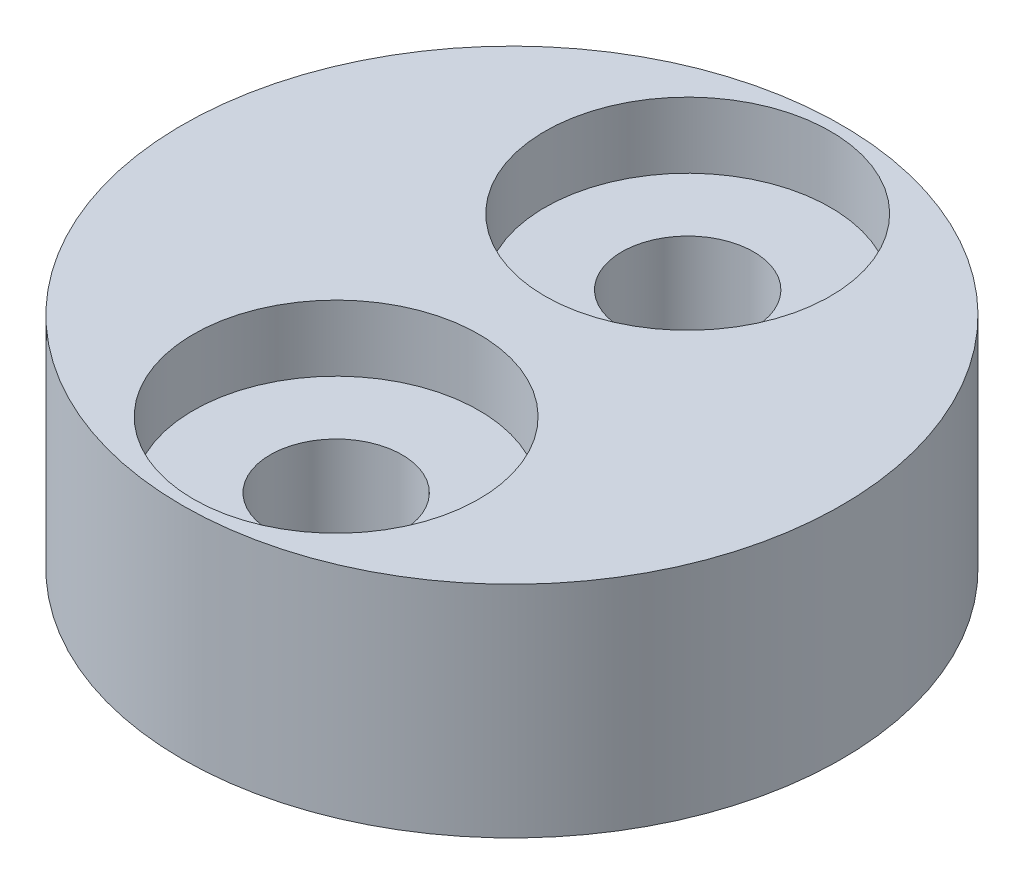
ISO-10303-21;
HEADER;
FILE_DESCRIPTION(('STEP AP214'),'2;1');
FILE_NAME('part.step','',(''),(''),'','','');
FILE_SCHEMA(('AUTOMOTIVE_DESIGN { 1 0 10303 214 1 1 1 1 }'));
ENDSEC;
DATA;
#1=APPLICATION_CONTEXT('core data for automotive mechanical design processes');
#2=APPLICATION_PROTOCOL_DEFINITION('international standard','automotive_design',2000,#1);
#3=PRODUCT_CONTEXT('',#1,'mechanical');
#4=PRODUCT('Part','Part','',(#3));
#5=PRODUCT_RELATED_PRODUCT_CATEGORY('part','',(#4));
#6=PRODUCT_DEFINITION_FORMATION('','',#4);
#7=PRODUCT_DEFINITION_CONTEXT('part definition',#1,'design');
#8=PRODUCT_DEFINITION('design','',#6,#7);
#9=PRODUCT_DEFINITION_SHAPE('','',#8);
#10=(LENGTH_UNIT() NAMED_UNIT(*) SI_UNIT(.MILLI.,.METRE.));
#11=(NAMED_UNIT(*) PLANE_ANGLE_UNIT() SI_UNIT($,.RADIAN.));
#12=(NAMED_UNIT(*) SI_UNIT($,.STERADIAN.) SOLID_ANGLE_UNIT());
#13=UNCERTAINTY_MEASURE_WITH_UNIT(LENGTH_MEASURE(1.E-05),#10,'distance_accuracy_value','');
#14=(GEOMETRIC_REPRESENTATION_CONTEXT(3) GLOBAL_UNCERTAINTY_ASSIGNED_CONTEXT((#13)) GLOBAL_UNIT_ASSIGNED_CONTEXT((#10,
#11,#12)) REPRESENTATION_CONTEXT('',''));
#15=CARTESIAN_POINT('',(0.,0.,0.));
#16=DIRECTION('',(0.,0.,1.));
#17=DIRECTION('',(1.,0.,0.));
#18=AXIS2_PLACEMENT_3D('',#15,#16,#17);
#19=CARTESIAN_POINT('',(0.,5.,-4.));
#20=DIRECTION('',(0.,-1.,0.));
#21=DIRECTION('',(0.,0.,-1.));
#22=AXIS2_PLACEMENT_3D('',#19,#20,#21);
#23=CYLINDRICAL_SURFACE('',#22,1.5);
#24=CARTESIAN_POINT('',(0.,0.,-4.));
#25=DIRECTION('',(0.,1.,0.));
#26=DIRECTION('',(0.,0.,1.));
#27=AXIS2_PLACEMENT_3D('',#24,#25,#26);
#28=CIRCLE('',#27,1.5);
#29=CARTESIAN_POINT('',(0.,0.,-2.5));
#30=VERTEX_POINT('',#29);
#31=EDGE_CURVE('E46',#30,#30,#28,.T.);
#32=ORIENTED_EDGE('',*,*,#31,.F.);
#33=EDGE_LOOP('',(#32));
#34=FACE_BOUND('',#33,.T.);
#35=CARTESIAN_POINT('',(0.,3.5,-4.));
#36=DIRECTION('',(0.,1.,0.));
#37=DIRECTION('',(0.,0.,1.));
#38=AXIS2_PLACEMENT_3D('',#35,#36,#37);
#39=CIRCLE('',#38,1.5);
#40=CARTESIAN_POINT('',(0.,3.5,-2.5));
#41=VERTEX_POINT('',#40);
#42=EDGE_CURVE('E37',#41,#41,#39,.T.);
#43=ORIENTED_EDGE('',*,*,#42,.T.);
#44=EDGE_LOOP('',(#43));
#45=FACE_BOUND('',#44,.T.);
#46=ADVANCED_FACE('F33',(#34,#45),#23,.F.);
#47=CARTESIAN_POINT('',(0.,5.,4.));
#48=DIRECTION('',(0.,-1.,0.));
#49=DIRECTION('',(0.,0.,-1.));
#50=AXIS2_PLACEMENT_3D('',#47,#48,#49);
#51=CYLINDRICAL_SURFACE('',#50,1.5);
#52=CARTESIAN_POINT('',(0.,0.,4.));
#53=DIRECTION('',(0.,1.,0.));
#54=DIRECTION('',(0.,0.,1.));
#55=AXIS2_PLACEMENT_3D('',#52,#53,#54);
#56=CIRCLE('',#55,1.5);
#57=CARTESIAN_POINT('',(0.,0.,5.5));
#58=VERTEX_POINT('',#57);
#59=EDGE_CURVE('E56',#58,#58,#56,.T.);
#60=ORIENTED_EDGE('',*,*,#59,.F.);
#61=EDGE_LOOP('',(#60));
#62=FACE_BOUND('',#61,.T.);
#63=CARTESIAN_POINT('',(0.,3.5,4.));
#64=DIRECTION('',(0.,1.,0.));
#65=DIRECTION('',(0.,0.,1.));
#66=AXIS2_PLACEMENT_3D('',#63,#64,#65);
#67=CIRCLE('',#66,1.5);
#68=CARTESIAN_POINT('',(0.,3.5,5.5));
#69=VERTEX_POINT('',#68);
#70=EDGE_CURVE('E50',#69,#69,#67,.T.);
#71=ORIENTED_EDGE('',*,*,#70,.T.);
#72=EDGE_LOOP('',(#71));
#73=FACE_BOUND('',#72,.T.);
#74=ADVANCED_FACE('F80',(#62,#73),#51,.F.);
#75=CARTESIAN_POINT('',(0.,5.,0.));
#76=DIRECTION('',(0.,1.,0.));
#77=DIRECTION('',(0.,0.,1.));
#78=AXIS2_PLACEMENT_3D('',#75,#76,#77);
#79=PLANE('',#78);
#80=CARTESIAN_POINT('',(0.,5.,-4.));
#81=DIRECTION('',(0.,1.,0.));
#82=DIRECTION('',(0.,0.,1.));
#83=AXIS2_PLACEMENT_3D('',#80,#81,#82);
#84=CIRCLE('',#83,3.25);
#85=CARTESIAN_POINT('',(0.,5.,-0.75));
#86=VERTEX_POINT('',#85);
#87=EDGE_CURVE('E58',#86,#86,#84,.T.);
#88=ORIENTED_EDGE('',*,*,#87,.F.);
#89=EDGE_LOOP('',(#88));
#90=FACE_BOUND('',#89,.T.);
#91=CARTESIAN_POINT('',(-4.03699863790571E-13,5.,4.));
#92=DIRECTION('',(0.,1.,0.));
#93=DIRECTION('',(0.,0.,1.));
#94=AXIS2_PLACEMENT_3D('',#91,#92,#93);
#95=CIRCLE('',#94,3.25);
#96=CARTESIAN_POINT('',(-4.03699863790571E-13,5.,7.25));
#97=VERTEX_POINT('',#96);
#98=EDGE_CURVE('E68',#97,#97,#95,.T.);
#99=ORIENTED_EDGE('',*,*,#98,.F.);
#100=EDGE_LOOP('',(#99));
#101=FACE_BOUND('',#100,.T.);
#102=CARTESIAN_POINT('',(0.,5.,0.));
#103=DIRECTION('',(0.,1.,0.));
#104=DIRECTION('',(0.,0.,1.));
#105=AXIS2_PLACEMENT_3D('',#102,#103,#104);
#106=CIRCLE('',#105,7.5);
#107=CARTESIAN_POINT('',(0.,5.,7.5));
#108=VERTEX_POINT('',#107);
#109=EDGE_CURVE('E10',#108,#108,#106,.T.);
#110=ORIENTED_EDGE('',*,*,#109,.T.);
#111=EDGE_LOOP('',(#110));
#112=FACE_BOUND('',#111,.T.);
#113=ADVANCED_FACE('F103',(#90,#101,#112),#79,.T.);
#114=CARTESIAN_POINT('',(0.,0.,0.));
#115=DIRECTION('',(0.,1.,0.));
#116=DIRECTION('',(0.,0.,1.));
#117=AXIS2_PLACEMENT_3D('',#114,#115,#116);
#118=PLANE('',#117);
#119=CARTESIAN_POINT('',(0.,0.,0.));
#120=DIRECTION('',(0.,1.,0.));
#121=DIRECTION('',(0.,0.,1.));
#122=AXIS2_PLACEMENT_3D('',#119,#120,#121);
#123=CIRCLE('',#122,7.5);
#124=CARTESIAN_POINT('',(0.,0.,7.5));
#125=VERTEX_POINT('',#124);
#126=EDGE_CURVE('E41',#125,#125,#123,.T.);
#127=ORIENTED_EDGE('',*,*,#126,.F.);
#128=EDGE_LOOP('',(#127));
#129=FACE_BOUND('',#128,.T.);
#130=ORIENTED_EDGE('',*,*,#31,.T.);
#131=EDGE_LOOP('',(#130));
#132=FACE_BOUND('',#131,.T.);
#133=ORIENTED_EDGE('',*,*,#59,.T.);
#134=EDGE_LOOP('',(#133));
#135=FACE_BOUND('',#134,.T.);
#136=ADVANCED_FACE('F76',(#129,#132,#135),#118,.F.);
#137=CARTESIAN_POINT('',(0.,5.,0.));
#138=DIRECTION('',(0.,-1.,0.));
#139=DIRECTION('',(0.,0.,-1.));
#140=AXIS2_PLACEMENT_3D('',#137,#138,#139);
#141=CYLINDRICAL_SURFACE('',#140,7.5);
#142=ORIENTED_EDGE('',*,*,#109,.F.);
#143=EDGE_LOOP('',(#142));
#144=FACE_BOUND('',#143,.T.);
#145=ORIENTED_EDGE('',*,*,#126,.T.);
#146=EDGE_LOOP('',(#145));
#147=FACE_BOUND('',#146,.T.);
#148=ADVANCED_FACE('F35',(#144,#147),#141,.T.);
#149=CARTESIAN_POINT('',(-4.03699863790571E-13,3.5,4.));
#150=DIRECTION('',(0.,1.,0.));
#151=DIRECTION('',(0.,0.,1.));
#152=AXIS2_PLACEMENT_3D('',#149,#150,#151);
#153=CYLINDRICAL_SURFACE('',#152,3.25);
#154=CARTESIAN_POINT('',(-4.03699863790571E-13,3.5,4.));
#155=DIRECTION('',(0.,1.,0.));
#156=DIRECTION('',(0.,0.,1.));
#157=AXIS2_PLACEMENT_3D('',#154,#155,#156);
#158=CIRCLE('',#157,3.25);
#159=CARTESIAN_POINT('',(-4.03699863790571E-13,3.5,7.25));
#160=VERTEX_POINT('',#159);
#161=EDGE_CURVE('E63',#160,#160,#158,.T.);
#162=ORIENTED_EDGE('',*,*,#161,.F.);
#163=EDGE_LOOP('',(#162));
#164=FACE_BOUND('',#163,.T.);
#165=ORIENTED_EDGE('',*,*,#98,.T.);
#166=EDGE_LOOP('',(#165));
#167=FACE_BOUND('',#166,.T.);
#168=ADVANCED_FACE('F97',(#164,#167),#153,.F.);
#169=CARTESIAN_POINT('',(-4.03699863790571E-13,3.5,4.));
#170=DIRECTION('',(0.,1.,0.));
#171=DIRECTION('',(0.,0.,1.));
#172=AXIS2_PLACEMENT_3D('',#169,#170,#171);
#173=PLANE('',#172);
#174=ORIENTED_EDGE('',*,*,#70,.F.);
#175=EDGE_LOOP('',(#174));
#176=FACE_BOUND('',#175,.T.);
#177=ORIENTED_EDGE('',*,*,#161,.T.);
#178=EDGE_LOOP('',(#177));
#179=FACE_BOUND('',#178,.T.);
#180=ADVANCED_FACE('F91',(#176,#179),#173,.T.);
#181=CARTESIAN_POINT('',(0.,3.5,-4.));
#182=DIRECTION('',(0.,1.,0.));
#183=DIRECTION('',(0.,0.,1.));
#184=AXIS2_PLACEMENT_3D('',#181,#182,#183);
#185=CYLINDRICAL_SURFACE('',#184,3.25);
#186=CARTESIAN_POINT('',(0.,3.5,-4.));
#187=DIRECTION('',(0.,1.,0.));
#188=DIRECTION('',(0.,0.,1.));
#189=AXIS2_PLACEMENT_3D('',#186,#187,#188);
#190=CIRCLE('',#189,3.25);
#191=CARTESIAN_POINT('',(0.,3.5,-0.75));
#192=VERTEX_POINT('',#191);
#193=EDGE_CURVE('E52',#192,#192,#190,.T.);
#194=ORIENTED_EDGE('',*,*,#193,.F.);
#195=EDGE_LOOP('',(#194));
#196=FACE_BOUND('',#195,.T.);
#197=ORIENTED_EDGE('',*,*,#87,.T.);
#198=EDGE_LOOP('',(#197));
#199=FACE_BOUND('',#198,.T.);
#200=ADVANCED_FACE('F86',(#196,#199),#185,.F.);
#201=CARTESIAN_POINT('',(0.,3.5,-4.));
#202=DIRECTION('',(0.,1.,0.));
#203=DIRECTION('',(0.,0.,1.));
#204=AXIS2_PLACEMENT_3D('',#201,#202,#203);
#205=PLANE('',#204);
#206=ORIENTED_EDGE('',*,*,#42,.F.);
#207=EDGE_LOOP('',(#206));
#208=FACE_BOUND('',#207,.T.);
#209=ORIENTED_EDGE('',*,*,#193,.T.);
#210=EDGE_LOOP('',(#209));
#211=FACE_BOUND('',#210,.T.);
#212=ADVANCED_FACE('F84',(#208,#211),#205,.T.);
#213=CLOSED_SHELL('',(#46,#74,#113,#136,#148,#168,#180,#200,#212));
#214=MANIFOLD_SOLID_BREP('B2',#213);
#215=ADVANCED_BREP_SHAPE_REPRESENTATION('',(#18,#214),#14);
#216=SHAPE_DEFINITION_REPRESENTATION(#9,#215);
ENDSEC;
END-ISO-10303-21;
